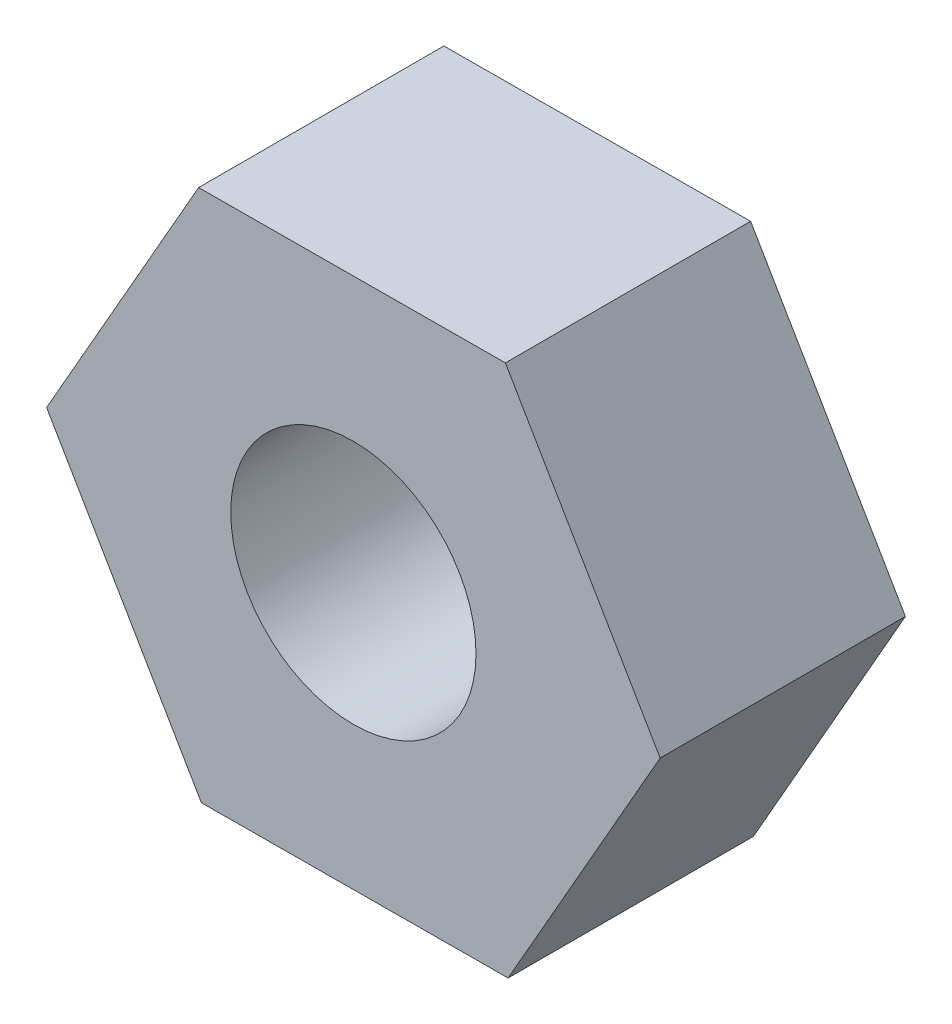
ISO-10303-21;
HEADER;
FILE_DESCRIPTION(('STEP AP214'),'2;1');
FILE_NAME('part.step','',(''),(''),'','','');
FILE_SCHEMA(('AUTOMOTIVE_DESIGN { 1 0 10303 214 1 1 1 1 }'));
ENDSEC;
DATA;
#1=APPLICATION_CONTEXT('core data for automotive mechanical design processes');
#2=APPLICATION_PROTOCOL_DEFINITION('international standard','automotive_design',2000,#1);
#3=PRODUCT_CONTEXT('',#1,'mechanical');
#4=PRODUCT('Part','Part','',(#3));
#5=PRODUCT_RELATED_PRODUCT_CATEGORY('part','',(#4));
#6=PRODUCT_DEFINITION_FORMATION('','',#4);
#7=PRODUCT_DEFINITION_CONTEXT('part definition',#1,'design');
#8=PRODUCT_DEFINITION('design','',#6,#7);
#9=PRODUCT_DEFINITION_SHAPE('','',#8);
#10=(LENGTH_UNIT() NAMED_UNIT(*) SI_UNIT(.MILLI.,.METRE.));
#11=(NAMED_UNIT(*) PLANE_ANGLE_UNIT() SI_UNIT($,.RADIAN.));
#12=(NAMED_UNIT(*) SI_UNIT($,.STERADIAN.) SOLID_ANGLE_UNIT());
#13=UNCERTAINTY_MEASURE_WITH_UNIT(LENGTH_MEASURE(1.E-05),#10,'distance_accuracy_value','');
#14=(GEOMETRIC_REPRESENTATION_CONTEXT(3) GLOBAL_UNCERTAINTY_ASSIGNED_CONTEXT((#13)) GLOBAL_UNIT_ASSIGNED_CONTEXT((#10,
#11,#12)) REPRESENTATION_CONTEXT('',''));
#15=CARTESIAN_POINT('',(0.,0.,0.));
#16=DIRECTION('',(0.,0.,1.));
#17=DIRECTION('',(1.,0.,0.));
#18=AXIS2_PLACEMENT_3D('',#15,#16,#17);
#19=CARTESIAN_POINT('',(-28.4013178813968,-5.07535558891581,-11.9999999999998));
#20=DIRECTION('',(0.0052244321485469,-0.999986352561259,0.));
#21=DIRECTION('',(0.99998635256126,0.00522443214854657,0.));
#22=AXIS2_PLACEMENT_3D('',#19,#20,#21);
#23=PLANE('',#22);
#24=DIRECTION('',(0.999986352561259,0.0052244321485469,0.));
#25=VECTOR('',#24,1.);
#26=CARTESIAN_POINT('',(-28.4013178813968,-5.07535558891581,1.73472347597681E-13));
#27=LINE('',#26,#25);
#28=CARTESIAN_POINT('',(-28.4013178813968,-5.07535558891581,1.73472347597681E-13));
#29=VERTEX_POINT('',#28);
#30=CARTESIAN_POINT('',(-13.3902108824665,-4.99693000861692,0.));
#31=VERTEX_POINT('',#30);
#32=EDGE_CURVE('E147',#29,#31,#27,.T.);
#33=ORIENTED_EDGE('',*,*,#32,.F.);
#34=DIRECTION('',(0.,0.,1.));
#35=VECTOR('',#34,1.);
#36=CARTESIAN_POINT('',(-28.4013178813968,-5.07535558891581,-11.9999999999998));
#37=LINE('',#36,#35);
#38=CARTESIAN_POINT('',(-28.4013178813968,-5.07535558891581,-11.9999999999998));
#39=VERTEX_POINT('',#38);
#40=EDGE_CURVE('E13',#39,#29,#37,.T.);
#41=ORIENTED_EDGE('',*,*,#40,.F.);
#42=DIRECTION('',(0.999986352561259,0.0052244321485469,0.));
#43=VECTOR('',#42,1.);
#44=CARTESIAN_POINT('',(-28.4013178813968,-5.07535558891581,-11.9999999999998));
#45=LINE('',#44,#43);
#46=CARTESIAN_POINT('',(-13.3902108824662,-4.99693000861706,-11.9999999999998));
#47=VERTEX_POINT('',#46);
#48=EDGE_CURVE('E168',#39,#47,#45,.T.);
#49=ORIENTED_EDGE('',*,*,#48,.T.);
#50=DIRECTION('',(0.,0.,1.));
#51=VECTOR('',#50,1.);
#52=CARTESIAN_POINT('',(-13.3902108824662,-4.99693000861706,-11.9999999999998));
#53=LINE('',#52,#51);
#54=EDGE_CURVE('E58',#47,#31,#53,.T.);
#55=ORIENTED_EDGE('',*,*,#54,.T.);
#56=EDGE_LOOP('',(#33,#41,#49,#55));
#57=FACE_BOUND('',#56,.T.);
#58=ADVANCED_FACE('F55',(#57),#23,.T.);
#59=CARTESIAN_POINT('',(-35.9747899257082,7.88543162093511,-11.9999999999999));
#60=DIRECTION('',(-0.863401368681519,-0.504517667241619,0.));
#61=DIRECTION('',(0.504517667241619,-0.863401368681519,0.));
#62=AXIS2_PLACEMENT_3D('',#59,#60,#61);
#63=PLANE('',#62);
#64=DIRECTION('',(0.504517667241619,-0.86340136868152,0.));
#65=VECTOR('',#64,1.);
#66=CARTESIAN_POINT('',(-35.9747899257079,7.88543162093516,0.));
#67=LINE('',#66,#65);
#68=CARTESIAN_POINT('',(-35.9747899257079,7.88543162093516,0.));
#69=VERTEX_POINT('',#68);
#70=EDGE_CURVE('E165',#69,#29,#67,.T.);
#71=ORIENTED_EDGE('',*,*,#70,.F.);
#72=DIRECTION('',(0.,0.,1.));
#73=VECTOR('',#72,1.);
#74=CARTESIAN_POINT('',(-35.9747899257082,7.88543162093511,-11.9999999999999));
#75=LINE('',#74,#73);
#76=CARTESIAN_POINT('',(-35.9747899257082,7.88543162093511,-11.9999999999999));
#77=VERTEX_POINT('',#76);
#78=EDGE_CURVE('E65',#77,#69,#75,.T.);
#79=ORIENTED_EDGE('',*,*,#78,.F.);
#80=DIRECTION('',(0.504517667241619,-0.86340136868152,0.));
#81=VECTOR('',#80,1.);
#82=CARTESIAN_POINT('',(-35.9747899257082,7.88543162093511,-11.9999999999999));
#83=LINE('',#82,#81);
#84=EDGE_CURVE('E132',#77,#39,#83,.T.);
#85=ORIENTED_EDGE('',*,*,#84,.T.);
#86=ORIENTED_EDGE('',*,*,#40,.T.);
#87=EDGE_LOOP('',(#71,#79,#85,#86));
#88=FACE_BOUND('',#87,.T.);
#89=ADVANCED_FACE('F182',(#88),#63,.T.);
#90=CARTESIAN_POINT('',(-28.5371549710881,20.9246444110849,-11.9999999999998));
#91=DIRECTION('',(-0.868625800830067,0.495468685319641,0.));
#92=DIRECTION('',(-0.49546868531964,-0.868625800830066,0.));
#93=AXIS2_PLACEMENT_3D('',#90,#91,#92);
#94=PLANE('',#93);
#95=DIRECTION('',(-0.49546868531964,-0.868625800830066,0.));
#96=VECTOR('',#95,1.);
#97=CARTESIAN_POINT('',(-28.5371549710881,20.9246444110849,0.));
#98=LINE('',#97,#96);
#99=CARTESIAN_POINT('',(-28.5371549710881,20.9246444110849,0.));
#100=VERTEX_POINT('',#99);
#101=EDGE_CURVE('E118',#100,#69,#98,.T.);
#102=ORIENTED_EDGE('',*,*,#101,.F.);
#103=DIRECTION('',(0.,0.,1.));
#104=VECTOR('',#103,1.);
#105=CARTESIAN_POINT('',(-28.5371549710881,20.9246444110849,-11.9999999999998));
#106=LINE('',#105,#104);
#107=CARTESIAN_POINT('',(-28.5371549710881,20.9246444110849,-11.9999999999998));
#108=VERTEX_POINT('',#107);
#109=EDGE_CURVE('E113',#108,#100,#106,.T.);
#110=ORIENTED_EDGE('',*,*,#109,.F.);
#111=DIRECTION('',(-0.49546868531964,-0.868625800830066,0.));
#112=VECTOR('',#111,1.);
#113=CARTESIAN_POINT('',(-28.5371549710881,20.9246444110849,-11.9999999999998));
#114=LINE('',#113,#112);
#115=EDGE_CURVE('E116',#108,#77,#114,.T.);
#116=ORIENTED_EDGE('',*,*,#115,.T.);
#117=ORIENTED_EDGE('',*,*,#78,.T.);
#118=EDGE_LOOP('',(#102,#110,#116,#117));
#119=FACE_BOUND('',#118,.T.);
#120=ADVANCED_FACE('F115',(#119),#94,.T.);
#121=CARTESIAN_POINT('',(-13.5260479721573,21.0030699913836,-11.9999999999998));
#122=DIRECTION('',(-0.0052244321485469,0.999986352561259,0.));
#123=DIRECTION('',(-0.999986352561259,-0.00522443214854657,0.));
#124=AXIS2_PLACEMENT_3D('',#121,#122,#123);
#125=PLANE('',#124);
#126=DIRECTION('',(-0.999986352561259,-0.0052244321485469,0.));
#127=VECTOR('',#126,1.);
#128=CARTESIAN_POINT('',(-13.5260479721573,21.0030699913838,0.));
#129=LINE('',#128,#127);
#130=CARTESIAN_POINT('',(-13.5260479721573,21.0030699913838,0.));
#131=VERTEX_POINT('',#130);
#132=EDGE_CURVE('E160',#131,#100,#129,.T.);
#133=ORIENTED_EDGE('',*,*,#132,.F.);
#134=DIRECTION('',(0.,0.,1.));
#135=VECTOR('',#134,1.);
#136=CARTESIAN_POINT('',(-13.5260479721573,21.0030699913836,-11.9999999999998));
#137=LINE('',#136,#135);
#138=CARTESIAN_POINT('',(-13.5260479721573,21.0030699913836,-11.9999999999998));
#139=VERTEX_POINT('',#138);
#140=EDGE_CURVE('E124',#139,#131,#137,.T.);
#141=ORIENTED_EDGE('',*,*,#140,.F.);
#142=DIRECTION('',(-0.999986352561259,-0.0052244321485469,0.));
#143=VECTOR('',#142,1.);
#144=CARTESIAN_POINT('',(-13.5260479721573,21.0030699913836,-11.9999999999998));
#145=LINE('',#144,#143);
#146=EDGE_CURVE('E130',#139,#108,#145,.T.);
#147=ORIENTED_EDGE('',*,*,#146,.T.);
#148=ORIENTED_EDGE('',*,*,#109,.T.);
#149=EDGE_LOOP('',(#133,#141,#147,#148));
#150=FACE_BOUND('',#149,.T.);
#151=ADVANCED_FACE('F135',(#150),#125,.T.);
#152=CARTESIAN_POINT('',(-5.95257592784668,8.04228278153266,-11.9999999999998));
#153=DIRECTION('',(0.863401368681519,0.504517667241619,0.));
#154=DIRECTION('',(-0.504517667241619,0.863401368681519,0.));
#155=AXIS2_PLACEMENT_3D('',#152,#153,#154);
#156=PLANE('',#155);
#157=DIRECTION('',(-0.504517667241619,0.863401368681519,0.));
#158=VECTOR('',#157,1.);
#159=CARTESIAN_POINT('',(-5.95257592784668,8.04228278153266,0.));
#160=LINE('',#159,#158);
#161=CARTESIAN_POINT('',(-5.95257592784668,8.04228278153266,0.));
#162=VERTEX_POINT('',#161);
#163=EDGE_CURVE('E156',#162,#131,#160,.T.);
#164=ORIENTED_EDGE('',*,*,#163,.F.);
#165=DIRECTION('',(0.,0.,1.));
#166=VECTOR('',#165,1.);
#167=CARTESIAN_POINT('',(-5.95257592784668,8.04228278153266,-11.9999999999998));
#168=LINE('',#167,#166);
#169=CARTESIAN_POINT('',(-5.95257592784668,8.04228278153266,-11.9999999999998));
#170=VERTEX_POINT('',#169);
#171=EDGE_CURVE('E173',#170,#162,#168,.T.);
#172=ORIENTED_EDGE('',*,*,#171,.F.);
#173=DIRECTION('',(-0.504517667241619,0.863401368681519,0.));
#174=VECTOR('',#173,1.);
#175=CARTESIAN_POINT('',(-5.95257592784668,8.04228278153266,-11.9999999999998));
#176=LINE('',#175,#174);
#177=EDGE_CURVE('E137',#170,#139,#176,.T.);
#178=ORIENTED_EDGE('',*,*,#177,.T.);
#179=ORIENTED_EDGE('',*,*,#140,.T.);
#180=EDGE_LOOP('',(#164,#172,#178,#179));
#181=FACE_BOUND('',#180,.T.);
#182=ADVANCED_FACE('F195',(#181),#156,.T.);
#183=CARTESIAN_POINT('',(-13.3902108824662,-4.99693000861706,-11.9999999999998));
#184=DIRECTION('',(0.868625800830067,-0.495468685319641,0.));
#185=DIRECTION('',(0.495468685319641,0.868625800830067,0.));
#186=AXIS2_PLACEMENT_3D('',#183,#184,#185);
#187=PLANE('',#186);
#188=DIRECTION('',(0.495468685319641,0.868625800830067,0.));
#189=VECTOR('',#188,1.);
#190=CARTESIAN_POINT('',(-13.3902108824665,-4.99693000861692,0.));
#191=LINE('',#190,#189);
#192=EDGE_CURVE('E151',#31,#162,#191,.T.);
#193=ORIENTED_EDGE('',*,*,#192,.F.);
#194=ORIENTED_EDGE('',*,*,#54,.F.);
#195=DIRECTION('',(0.495468685319641,0.868625800830067,0.));
#196=VECTOR('',#195,1.);
#197=CARTESIAN_POINT('',(-13.3902108824662,-4.99693000861706,-11.9999999999998));
#198=LINE('',#197,#196);
#199=EDGE_CURVE('E141',#47,#170,#198,.T.);
#200=ORIENTED_EDGE('',*,*,#199,.T.);
#201=ORIENTED_EDGE('',*,*,#171,.T.);
#202=EDGE_LOOP('',(#193,#194,#200,#201));
#203=FACE_BOUND('',#202,.T.);
#204=ADVANCED_FACE('F179',(#203),#187,.T.);
#205=CARTESIAN_POINT('',(0.,0.,-11.9999999999998));
#206=DIRECTION('',(0.,0.,1.));
#207=DIRECTION('',(1.00000000000002,0.,0.));
#208=AXIS2_PLACEMENT_3D('',#205,#206,#207);
#209=PLANE('',#208);
#210=CARTESIAN_POINT('',(-20.9636829267773,7.96385720123402,-11.9999999999998));
#211=DIRECTION('',(0.,0.,1.));
#212=DIRECTION('',(1.00000000000002,0.,0.));
#213=AXIS2_PLACEMENT_3D('',#210,#211,#212);
#214=CIRCLE('',#213,6.);
#215=CARTESIAN_POINT('',(-14.9636829267772,7.96385720123402,-11.9999999999998));
#216=VERTEX_POINT('',#215);
#217=EDGE_CURVE('E152',#216,#216,#214,.T.);
#218=ORIENTED_EDGE('',*,*,#217,.T.);
#219=EDGE_LOOP('',(#218));
#220=FACE_BOUND('',#219,.T.);
#221=ORIENTED_EDGE('',*,*,#48,.F.);
#222=ORIENTED_EDGE('',*,*,#84,.F.);
#223=ORIENTED_EDGE('',*,*,#115,.F.);
#224=ORIENTED_EDGE('',*,*,#146,.F.);
#225=ORIENTED_EDGE('',*,*,#177,.F.);
#226=ORIENTED_EDGE('',*,*,#199,.F.);
#227=EDGE_LOOP('',(#221,#222,#223,#224,#225,#226));
#228=FACE_BOUND('',#227,.T.);
#229=ADVANCED_FACE('F128',(#220,#228),#209,.F.);
#230=CARTESIAN_POINT('',(0.,0.,0.));
#231=DIRECTION('',(0.,0.,1.));
#232=DIRECTION('',(1.00000000000002,0.,0.));
#233=AXIS2_PLACEMENT_3D('',#230,#231,#232);
#234=PLANE('',#233);
#235=CARTESIAN_POINT('',(-20.9636829267773,7.96385720123402,0.));
#236=DIRECTION('',(0.,0.,1.));
#237=DIRECTION('',(1.00000000000002,0.,0.));
#238=AXIS2_PLACEMENT_3D('',#235,#236,#237);
#239=CIRCLE('',#238,6.);
#240=CARTESIAN_POINT('',(-14.9636829267772,7.96385720123402,0.));
#241=VERTEX_POINT('',#240);
#242=EDGE_CURVE('E218',#241,#241,#239,.T.);
#243=ORIENTED_EDGE('',*,*,#242,.F.);
#244=EDGE_LOOP('',(#243));
#245=FACE_BOUND('',#244,.T.);
#246=ORIENTED_EDGE('',*,*,#32,.T.);
#247=ORIENTED_EDGE('',*,*,#192,.T.);
#248=ORIENTED_EDGE('',*,*,#163,.T.);
#249=ORIENTED_EDGE('',*,*,#132,.T.);
#250=ORIENTED_EDGE('',*,*,#101,.T.);
#251=ORIENTED_EDGE('',*,*,#70,.T.);
#252=EDGE_LOOP('',(#246,#247,#248,#249,#250,#251));
#253=FACE_BOUND('',#252,.T.);
#254=ADVANCED_FACE('F181',(#245,#253),#234,.T.);
#255=CARTESIAN_POINT('',(-20.9636829267773,7.96385720123402,-11.9999999999998));
#256=DIRECTION('',(0.,0.,1.));
#257=DIRECTION('',(1.00000000000002,0.,0.));
#258=AXIS2_PLACEMENT_3D('',#255,#256,#257);
#259=CYLINDRICAL_SURFACE('',#258,6.);
#260=ORIENTED_EDGE('',*,*,#217,.F.);
#261=EDGE_LOOP('',(#260));
#262=FACE_BOUND('',#261,.T.);
#263=ORIENTED_EDGE('',*,*,#242,.T.);
#264=EDGE_LOOP('',(#263));
#265=FACE_BOUND('',#264,.T.);
#266=ADVANCED_FACE('F206',(#262,#265),#259,.F.);
#267=CLOSED_SHELL('',(#58,#89,#120,#151,#182,#204,#229,#254,#266));
#268=MANIFOLD_SOLID_BREP('B2',#267);
#269=ADVANCED_BREP_SHAPE_REPRESENTATION('',(#18,#268),#14);
#270=SHAPE_DEFINITION_REPRESENTATION(#9,#269);
ENDSEC;
END-ISO-10303-21;
